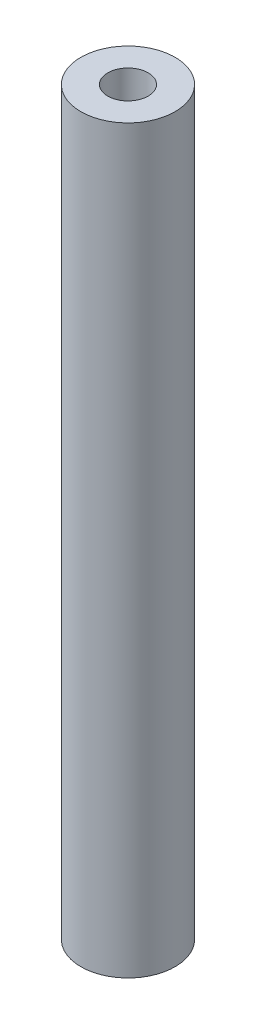
ISO-10303-21;
HEADER;
FILE_DESCRIPTION(('STEP AP214'),'2;1');
FILE_NAME('part.step','',(''),(''),'','','');
FILE_SCHEMA(('AUTOMOTIVE_DESIGN { 1 0 10303 214 1 1 1 1 }'));
ENDSEC;
DATA;
#1=APPLICATION_CONTEXT('core data for automotive mechanical design processes');
#2=APPLICATION_PROTOCOL_DEFINITION('international standard','automotive_design',2000,#1);
#3=PRODUCT_CONTEXT('',#1,'mechanical');
#4=PRODUCT('Part','Part','',(#3));
#5=PRODUCT_RELATED_PRODUCT_CATEGORY('part','',(#4));
#6=PRODUCT_DEFINITION_FORMATION('','',#4);
#7=PRODUCT_DEFINITION_CONTEXT('part definition',#1,'design');
#8=PRODUCT_DEFINITION('design','',#6,#7);
#9=PRODUCT_DEFINITION_SHAPE('','',#8);
#10=(LENGTH_UNIT() NAMED_UNIT(*) SI_UNIT(.MILLI.,.METRE.));
#11=(NAMED_UNIT(*) PLANE_ANGLE_UNIT() SI_UNIT($,.RADIAN.));
#12=(NAMED_UNIT(*) SI_UNIT($,.STERADIAN.) SOLID_ANGLE_UNIT());
#13=UNCERTAINTY_MEASURE_WITH_UNIT(LENGTH_MEASURE(1.E-05),#10,'distance_accuracy_value','');
#14=(GEOMETRIC_REPRESENTATION_CONTEXT(3) GLOBAL_UNCERTAINTY_ASSIGNED_CONTEXT((#13)) GLOBAL_UNIT_ASSIGNED_CONTEXT((#10,
#11,#12)) REPRESENTATION_CONTEXT('',''));
#15=CARTESIAN_POINT('',(0.,0.,0.));
#16=DIRECTION('',(0.,0.,1.));
#17=DIRECTION('',(1.,0.,0.));
#18=AXIS2_PLACEMENT_3D('',#15,#16,#17);
#19=CARTESIAN_POINT('',(0.,55.,0.));
#20=DIRECTION('',(0.,1.,0.));
#21=DIRECTION('',(0.,0.,1.));
#22=AXIS2_PLACEMENT_3D('',#19,#20,#21);
#23=PLANE('',#22);
#24=CARTESIAN_POINT('',(0.,55.,0.));
#25=DIRECTION('',(0.,1.,0.));
#26=DIRECTION('',(0.,0.,1.));
#27=AXIS2_PLACEMENT_3D('',#24,#25,#26);
#28=CIRCLE('',#27,3.5);
#29=CARTESIAN_POINT('',(0.,55.,3.5));
#30=VERTEX_POINT('',#29);
#31=EDGE_CURVE('E10',#30,#30,#28,.T.);
#32=ORIENTED_EDGE('',*,*,#31,.T.);
#33=EDGE_LOOP('',(#32));
#34=FACE_BOUND('',#33,.T.);
#35=CARTESIAN_POINT('',(0.,55.,0.));
#36=DIRECTION('',(0.,1.,0.));
#37=DIRECTION('',(0.,0.,1.));
#38=AXIS2_PLACEMENT_3D('',#35,#36,#37);
#39=CIRCLE('',#38,1.5);
#40=CARTESIAN_POINT('',(0.,55.,1.5));
#41=VERTEX_POINT('',#40);
#42=EDGE_CURVE('E42',#41,#41,#39,.T.);
#43=ORIENTED_EDGE('',*,*,#42,.F.);
#44=EDGE_LOOP('',(#43));
#45=FACE_BOUND('',#44,.T.);
#46=ADVANCED_FACE('F31',(#34,#45),#23,.T.);
#47=CARTESIAN_POINT('',(0.,0.,0.));
#48=DIRECTION('',(0.,1.,0.));
#49=DIRECTION('',(0.,0.,1.));
#50=AXIS2_PLACEMENT_3D('',#47,#48,#49);
#51=PLANE('',#50);
#52=CARTESIAN_POINT('',(0.,0.,0.));
#53=DIRECTION('',(0.,1.,0.));
#54=DIRECTION('',(0.,0.,1.));
#55=AXIS2_PLACEMENT_3D('',#52,#53,#54);
#56=CIRCLE('',#55,3.5);
#57=CARTESIAN_POINT('',(0.,0.,3.5));
#58=VERTEX_POINT('',#57);
#59=EDGE_CURVE('E35',#58,#58,#56,.T.);
#60=ORIENTED_EDGE('',*,*,#59,.F.);
#61=EDGE_LOOP('',(#60));
#62=FACE_BOUND('',#61,.T.);
#63=CARTESIAN_POINT('',(0.,0.,0.));
#64=DIRECTION('',(0.,1.,0.));
#65=DIRECTION('',(0.,0.,1.));
#66=AXIS2_PLACEMENT_3D('',#63,#64,#65);
#67=CIRCLE('',#66,1.5);
#68=CARTESIAN_POINT('',(0.,0.,1.5));
#69=VERTEX_POINT('',#68);
#70=EDGE_CURVE('E44',#69,#69,#67,.T.);
#71=ORIENTED_EDGE('',*,*,#70,.T.);
#72=EDGE_LOOP('',(#71));
#73=FACE_BOUND('',#72,.T.);
#74=ADVANCED_FACE('F54',(#62,#73),#51,.F.);
#75=CARTESIAN_POINT('',(0.,55.,0.));
#76=DIRECTION('',(0.,-1.,0.));
#77=DIRECTION('',(0.,0.,-1.));
#78=AXIS2_PLACEMENT_3D('',#75,#76,#77);
#79=CYLINDRICAL_SURFACE('',#78,3.5);
#80=ORIENTED_EDGE('',*,*,#31,.F.);
#81=EDGE_LOOP('',(#80));
#82=FACE_BOUND('',#81,.T.);
#83=ORIENTED_EDGE('',*,*,#59,.T.);
#84=EDGE_LOOP('',(#83));
#85=FACE_BOUND('',#84,.T.);
#86=ADVANCED_FACE('F33',(#82,#85),#79,.T.);
#87=CARTESIAN_POINT('',(0.,55.,0.));
#88=DIRECTION('',(0.,-1.,0.));
#89=DIRECTION('',(0.,0.,-1.));
#90=AXIS2_PLACEMENT_3D('',#87,#88,#89);
#91=CYLINDRICAL_SURFACE('',#90,1.5);
#92=ORIENTED_EDGE('',*,*,#42,.T.);
#93=EDGE_LOOP('',(#92));
#94=FACE_BOUND('',#93,.T.);
#95=ORIENTED_EDGE('',*,*,#70,.F.);
#96=EDGE_LOOP('',(#95));
#97=FACE_BOUND('',#96,.T.);
#98=ADVANCED_FACE('F50',(#94,#97),#91,.F.);
#99=CLOSED_SHELL('',(#46,#74,#86,#98));
#100=MANIFOLD_SOLID_BREP('B2',#99);
#101=ADVANCED_BREP_SHAPE_REPRESENTATION('',(#18,#100),#14);
#102=SHAPE_DEFINITION_REPRESENTATION(#9,#101);
ENDSEC;
END-ISO-10303-21;
